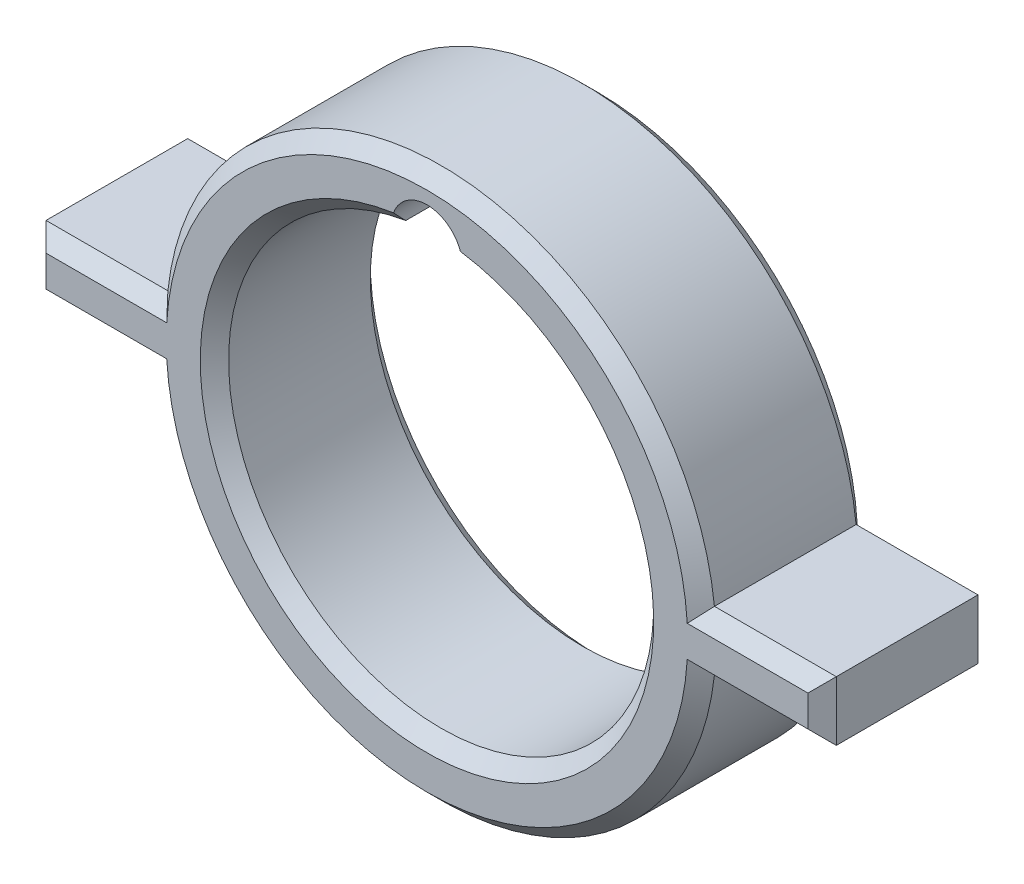
ISO-10303-21;
HEADER;
FILE_DESCRIPTION(('STEP AP214'),'2;1');
FILE_NAME('part.step','',(''),(''),'','','');
FILE_SCHEMA(('AUTOMOTIVE_DESIGN { 1 0 10303 214 1 1 1 1 }'));
ENDSEC;
DATA;
#1=APPLICATION_CONTEXT('core data for automotive mechanical design processes');
#2=APPLICATION_PROTOCOL_DEFINITION('international standard','automotive_design',2000,#1);
#3=PRODUCT_CONTEXT('',#1,'mechanical');
#4=PRODUCT('Part','Part','',(#3));
#5=PRODUCT_RELATED_PRODUCT_CATEGORY('part','',(#4));
#6=PRODUCT_DEFINITION_FORMATION('','',#4);
#7=PRODUCT_DEFINITION_CONTEXT('part definition',#1,'design');
#8=PRODUCT_DEFINITION('design','',#6,#7);
#9=PRODUCT_DEFINITION_SHAPE('','',#8);
#10=(LENGTH_UNIT() NAMED_UNIT(*) SI_UNIT(.MILLI.,.METRE.));
#11=(NAMED_UNIT(*) PLANE_ANGLE_UNIT() SI_UNIT($,.RADIAN.));
#12=(NAMED_UNIT(*) SI_UNIT($,.STERADIAN.) SOLID_ANGLE_UNIT());
#13=UNCERTAINTY_MEASURE_WITH_UNIT(LENGTH_MEASURE(1.E-05),#10,'distance_accuracy_value','');
#14=(GEOMETRIC_REPRESENTATION_CONTEXT(3) GLOBAL_UNCERTAINTY_ASSIGNED_CONTEXT((#13)) GLOBAL_UNIT_ASSIGNED_CONTEXT((#10,
#11,#12)) REPRESENTATION_CONTEXT('',''));
#15=CARTESIAN_POINT('',(0.,0.,0.));
#16=DIRECTION('',(0.,0.,1.));
#17=DIRECTION('',(1.,0.,0.));
#18=AXIS2_PLACEMENT_3D('',#15,#16,#17);
#19=CARTESIAN_POINT('',(0.,0.,6.));
#20=DIRECTION('',(0.,0.,1.));
#21=DIRECTION('',(1.,0.,0.));
#22=AXIS2_PLACEMENT_3D('',#19,#20,#21);
#23=PLANE('',#22);
#24=CARTESIAN_POINT('',(0.,7.5,6.));
#25=DIRECTION('',(0.,0.,1.));
#26=DIRECTION('',(1.,0.,0.));
#27=AXIS2_PLACEMENT_3D('',#24,#25,#26);
#28=CIRCLE('',#27,1.25);
#29=CARTESIAN_POINT('',(1.17997616501351,7.91250000000001,6.));
#30=VERTEX_POINT('',#29);
#31=CARTESIAN_POINT('',(-1.17997616501351,7.91250000000001,6.));
#32=VERTEX_POINT('',#31);
#33=EDGE_CURVE('E324',#30,#32,#28,.T.);
#34=ORIENTED_EDGE('',*,*,#33,.F.);
#35=CARTESIAN_POINT('',(0.,0.,6.));
#36=DIRECTION('',(0.,0.,1.));
#37=DIRECTION('',(1.,0.,0.));
#38=AXIS2_PLACEMENT_3D('',#35,#36,#37);
#39=CIRCLE('',#38,8.00000000000001);
#40=EDGE_CURVE('E386',#30,#32,#39,.F.);
#41=ORIENTED_EDGE('',*,*,#40,.T.);
#42=EDGE_LOOP('',(#34,#41));
#43=FACE_BOUND('',#42,.T.);
#44=DIRECTION('',(-1.,0.,0.));
#45=VECTOR('',#44,1.);
#46=CARTESIAN_POINT('',(9.6430026444049,0.550000000000006,6.));
#47=LINE('',#46,#45);
#48=CARTESIAN_POINT('',(13.4430026444049,0.550000000000006,6.));
#49=VERTEX_POINT('',#48);
#50=CARTESIAN_POINT('',(9.18354506712958,0.550000000000006,6.));
#51=VERTEX_POINT('',#50);
#52=EDGE_CURVE('E381',#49,#51,#47,.T.);
#53=ORIENTED_EDGE('',*,*,#52,.T.);
#54=CARTESIAN_POINT('',(0.,0.,6.));
#55=DIRECTION('',(0.,0.,1.));
#56=DIRECTION('',(1.,0.,0.));
#57=AXIS2_PLACEMENT_3D('',#54,#55,#56);
#58=CIRCLE('',#57,9.2);
#59=CARTESIAN_POINT('',(-9.18354506712958,0.550000000000004,6.));
#60=VERTEX_POINT('',#59);
#61=EDGE_CURVE('E383',#51,#60,#58,.T.);
#62=ORIENTED_EDGE('',*,*,#61,.T.);
#63=DIRECTION('',(-1.,0.,0.));
#64=VECTOR('',#63,1.);
#65=CARTESIAN_POINT('',(-13.9430026444049,0.550000000000003,6.));
#66=LINE('',#65,#64);
#67=CARTESIAN_POINT('',(-13.4430026444049,0.550000000000003,6.));
#68=VERTEX_POINT('',#67);
#69=EDGE_CURVE('E369',#60,#68,#66,.T.);
#70=ORIENTED_EDGE('',*,*,#69,.T.);
#71=DIRECTION('',(0.,-1.,0.));
#72=VECTOR('',#71,1.);
#73=CARTESIAN_POINT('',(-13.4430026444049,-1.05,6.));
#74=LINE('',#73,#72);
#75=CARTESIAN_POINT('',(-13.4430026444049,-0.550000000000003,6.));
#76=VERTEX_POINT('',#75);
#77=EDGE_CURVE('E371',#68,#76,#74,.T.);
#78=ORIENTED_EDGE('',*,*,#77,.T.);
#79=DIRECTION('',(1.,0.,0.));
#80=VECTOR('',#79,1.);
#81=CARTESIAN_POINT('',(-9.6430026444049,-0.550000000000004,6.));
#82=LINE('',#81,#80);
#83=CARTESIAN_POINT('',(-9.18354506712958,-0.550000000000004,6.));
#84=VERTEX_POINT('',#83);
#85=EDGE_CURVE('E373',#76,#84,#82,.T.);
#86=ORIENTED_EDGE('',*,*,#85,.T.);
#87=CARTESIAN_POINT('',(0.,0.,6.));
#88=DIRECTION('',(0.,0.,1.));
#89=DIRECTION('',(1.,0.,0.));
#90=AXIS2_PLACEMENT_3D('',#87,#88,#89);
#91=CIRCLE('',#90,9.2);
#92=CARTESIAN_POINT('',(9.18354506712958,-0.550000000000007,6.));
#93=VERTEX_POINT('',#92);
#94=EDGE_CURVE('E375',#84,#93,#91,.T.);
#95=ORIENTED_EDGE('',*,*,#94,.T.);
#96=DIRECTION('',(1.,0.,0.));
#97=VECTOR('',#96,1.);
#98=CARTESIAN_POINT('',(13.9430026444049,-0.55,6.));
#99=LINE('',#98,#97);
#100=CARTESIAN_POINT('',(13.4430026444049,-0.55,6.));
#101=VERTEX_POINT('',#100);
#102=EDGE_CURVE('E377',#93,#101,#99,.T.);
#103=ORIENTED_EDGE('',*,*,#102,.T.);
#104=DIRECTION('',(0.,1.,0.));
#105=VECTOR('',#104,1.);
#106=CARTESIAN_POINT('',(13.4430026444049,1.05,6.));
#107=LINE('',#106,#105);
#108=EDGE_CURVE('E379',#101,#49,#107,.T.);
#109=ORIENTED_EDGE('',*,*,#108,.T.);
#110=EDGE_LOOP('',(#53,#62,#70,#78,#86,#95,#103,#109));
#111=FACE_BOUND('',#110,.T.);
#112=ADVANCED_FACE('F41',(#43,#111),#23,.T.);
#113=CARTESIAN_POINT('',(0.,0.,0.));
#114=DIRECTION('',(0.,0.,1.));
#115=DIRECTION('',(1.,0.,0.));
#116=AXIS2_PLACEMENT_3D('',#113,#114,#115);
#117=PLANE('',#116);
#118=CARTESIAN_POINT('',(0.,0.,0.));
#119=DIRECTION('',(0.,0.,1.));
#120=DIRECTION('',(1.,0.,0.));
#121=AXIS2_PLACEMENT_3D('',#118,#119,#120);
#122=CIRCLE('',#121,7.99999999999999);
#123=CARTESIAN_POINT('',(-1.17997616501352,7.91249999999999,0.));
#124=VERTEX_POINT('',#123);
#125=CARTESIAN_POINT('',(1.17997616501352,7.91249999999999,0.));
#126=VERTEX_POINT('',#125);
#127=EDGE_CURVE('E193',#124,#126,#122,.T.);
#128=ORIENTED_EDGE('',*,*,#127,.T.);
#129=CARTESIAN_POINT('',(0.,7.5,0.));
#130=DIRECTION('',(0.,0.,-1.));
#131=DIRECTION('',(-1.,0.,0.));
#132=AXIS2_PLACEMENT_3D('',#129,#130,#131);
#133=CIRCLE('',#132,1.25);
#134=EDGE_CURVE('E62',#124,#126,#133,.T.);
#135=ORIENTED_EDGE('',*,*,#134,.F.);
#136=EDGE_LOOP('',(#128,#135));
#137=FACE_BOUND('',#136,.T.);
#138=DIRECTION('',(-1.,0.,0.));
#139=VECTOR('',#138,1.);
#140=CARTESIAN_POINT('',(0.,-0.550000000000005,0.));
#141=LINE('',#140,#139);
#142=CARTESIAN_POINT('',(-9.18354506712958,-0.550000000000004,0.));
#143=VERTEX_POINT('',#142);
#144=CARTESIAN_POINT('',(-13.4430026444049,-0.550000000000003,0.));
#145=VERTEX_POINT('',#144);
#146=EDGE_CURVE('E70',#143,#145,#141,.T.);
#147=ORIENTED_EDGE('',*,*,#146,.T.);
#148=DIRECTION('',(0.,1.,0.));
#149=VECTOR('',#148,1.);
#150=CARTESIAN_POINT('',(-13.4430026444049,0.,0.));
#151=LINE('',#150,#149);
#152=CARTESIAN_POINT('',(-13.4430026444049,0.550000000000003,0.));
#153=VERTEX_POINT('',#152);
#154=EDGE_CURVE('E197',#145,#153,#151,.T.);
#155=ORIENTED_EDGE('',*,*,#154,.T.);
#156=DIRECTION('',(1.,0.,0.));
#157=VECTOR('',#156,1.);
#158=CARTESIAN_POINT('',(0.,0.550000000000005,0.));
#159=LINE('',#158,#157);
#160=CARTESIAN_POINT('',(-9.18354506712958,0.550000000000004,0.));
#161=VERTEX_POINT('',#160);
#162=EDGE_CURVE('E423',#153,#161,#159,.T.);
#163=ORIENTED_EDGE('',*,*,#162,.T.);
#164=CARTESIAN_POINT('',(0.,0.,0.));
#165=DIRECTION('',(0.,0.,1.));
#166=DIRECTION('',(1.,0.,0.));
#167=AXIS2_PLACEMENT_3D('',#164,#165,#166);
#168=CIRCLE('',#167,9.2);
#169=CARTESIAN_POINT('',(9.18354506712958,0.550000000000006,0.));
#170=VERTEX_POINT('',#169);
#171=EDGE_CURVE('E425',#161,#170,#168,.F.);
#172=ORIENTED_EDGE('',*,*,#171,.T.);
#173=DIRECTION('',(1.,0.,0.));
#174=VECTOR('',#173,1.);
#175=CARTESIAN_POINT('',(0.,0.550000000000005,0.));
#176=LINE('',#175,#174);
#177=CARTESIAN_POINT('',(13.4430026444049,0.550000000000006,0.));
#178=VERTEX_POINT('',#177);
#179=EDGE_CURVE('E427',#170,#178,#176,.T.);
#180=ORIENTED_EDGE('',*,*,#179,.T.);
#181=DIRECTION('',(0.,-1.,0.));
#182=VECTOR('',#181,1.);
#183=CARTESIAN_POINT('',(13.4430026444049,0.,0.));
#184=LINE('',#183,#182);
#185=CARTESIAN_POINT('',(13.4430026444049,-0.55,0.));
#186=VERTEX_POINT('',#185);
#187=EDGE_CURVE('E429',#178,#186,#184,.T.);
#188=ORIENTED_EDGE('',*,*,#187,.T.);
#189=DIRECTION('',(-1.,0.,0.));
#190=VECTOR('',#189,1.);
#191=CARTESIAN_POINT('',(0.,-0.55000000000002,0.));
#192=LINE('',#191,#190);
#193=CARTESIAN_POINT('',(9.18354506712958,-0.550000000000007,0.));
#194=VERTEX_POINT('',#193);
#195=EDGE_CURVE('E431',#186,#194,#192,.T.);
#196=ORIENTED_EDGE('',*,*,#195,.T.);
#197=CARTESIAN_POINT('',(0.,0.,0.));
#198=DIRECTION('',(0.,0.,1.));
#199=DIRECTION('',(1.,0.,0.));
#200=AXIS2_PLACEMENT_3D('',#197,#198,#199);
#201=CIRCLE('',#200,9.2);
#202=EDGE_CURVE('E433',#194,#143,#201,.F.);
#203=ORIENTED_EDGE('',*,*,#202,.T.);
#204=EDGE_LOOP('',(#147,#155,#163,#172,#180,#188,#196,#203));
#205=FACE_BOUND('',#204,.T.);
#206=ADVANCED_FACE('F192',(#137,#205),#117,.F.);
#207=CARTESIAN_POINT('',(-9.6430026444049,1.05,6.));
#208=DIRECTION('',(0.,-1.,0.));
#209=DIRECTION('',(1.,0.,0.));
#210=AXIS2_PLACEMENT_3D('',#207,#208,#209);
#211=PLANE('',#210);
#212=DIRECTION('',(0.,0.,-1.));
#213=VECTOR('',#212,1.);
#214=CARTESIAN_POINT('',(-13.9430026444049,1.05,6.));
#215=LINE('',#214,#213);
#216=CARTESIAN_POINT('',(-13.9430026444049,1.05,5.5));
#217=VERTEX_POINT('',#216);
#218=CARTESIAN_POINT('',(-13.9430026444049,1.05,0.499999999999997));
#219=VERTEX_POINT('',#218);
#220=EDGE_CURVE('E361',#217,#219,#215,.T.);
#221=ORIENTED_EDGE('',*,*,#220,.F.);
#222=DIRECTION('',(1.,0.,0.));
#223=VECTOR('',#222,1.);
#224=CARTESIAN_POINT('',(-9.6430026444049,1.05,5.5));
#225=LINE('',#224,#223);
#226=CARTESIAN_POINT('',(-9.6430026444049,1.05,5.5));
#227=VERTEX_POINT('',#226);
#228=EDGE_CURVE('E421',#217,#227,#225,.T.);
#229=ORIENTED_EDGE('',*,*,#228,.T.);
#230=DIRECTION('',(0.,0.,-1.));
#231=VECTOR('',#230,1.);
#232=CARTESIAN_POINT('',(-9.6430026444049,1.05,6.));
#233=LINE('',#232,#231);
#234=CARTESIAN_POINT('',(-9.6430026444049,1.05,0.499999999999997));
#235=VERTEX_POINT('',#234);
#236=EDGE_CURVE('E281',#227,#235,#233,.T.);
#237=ORIENTED_EDGE('',*,*,#236,.T.);
#238=DIRECTION('',(-1.,0.,0.));
#239=VECTOR('',#238,1.);
#240=CARTESIAN_POINT('',(-9.6430026444049,1.05,0.499999999999997));
#241=LINE('',#240,#239);
#242=EDGE_CURVE('E419',#235,#219,#241,.T.);
#243=ORIENTED_EDGE('',*,*,#242,.T.);
#244=EDGE_LOOP('',(#221,#229,#237,#243));
#245=FACE_BOUND('',#244,.T.);
#246=ADVANCED_FACE('F331',(#245),#211,.F.);
#247=CARTESIAN_POINT('',(-13.9430026444049,1.05,6.));
#248=DIRECTION('',(1.,0.,0.));
#249=DIRECTION('',(0.,0.,-1.));
#250=AXIS2_PLACEMENT_3D('',#247,#248,#249);
#251=PLANE('',#250);
#252=DIRECTION('',(0.,0.,-1.));
#253=VECTOR('',#252,1.);
#254=CARTESIAN_POINT('',(-13.9430026444049,-1.05,6.));
#255=LINE('',#254,#253);
#256=CARTESIAN_POINT('',(-13.9430026444049,-1.05,5.5));
#257=VERTEX_POINT('',#256);
#258=CARTESIAN_POINT('',(-13.9430026444049,-1.05,0.499999999999997));
#259=VERTEX_POINT('',#258);
#260=EDGE_CURVE('E358',#257,#259,#255,.T.);
#261=ORIENTED_EDGE('',*,*,#260,.F.);
#262=DIRECTION('',(0.,1.,0.));
#263=VECTOR('',#262,1.);
#264=CARTESIAN_POINT('',(-13.9430026444049,1.05,5.5));
#265=LINE('',#264,#263);
#266=EDGE_CURVE('E417',#257,#217,#265,.T.);
#267=ORIENTED_EDGE('',*,*,#266,.T.);
#268=ORIENTED_EDGE('',*,*,#220,.T.);
#269=DIRECTION('',(0.,-1.,0.));
#270=VECTOR('',#269,1.);
#271=CARTESIAN_POINT('',(-13.9430026444049,1.05,0.499999999999997));
#272=LINE('',#271,#270);
#273=EDGE_CURVE('E414',#219,#259,#272,.T.);
#274=ORIENTED_EDGE('',*,*,#273,.T.);
#275=EDGE_LOOP('',(#261,#267,#268,#274));
#276=FACE_BOUND('',#275,.T.);
#277=ADVANCED_FACE('F545',(#276),#251,.F.);
#278=CARTESIAN_POINT('',(-13.9430026444049,-1.05,6.));
#279=DIRECTION('',(0.,1.,0.));
#280=DIRECTION('',(-1.,0.,0.));
#281=AXIS2_PLACEMENT_3D('',#278,#279,#280);
#282=PLANE('',#281);
#283=DIRECTION('',(0.,0.,-1.));
#284=VECTOR('',#283,1.);
#285=CARTESIAN_POINT('',(-9.6430026444049,-1.05,6.));
#286=LINE('',#285,#284);
#287=CARTESIAN_POINT('',(-9.6430026444049,-1.05,5.5));
#288=VERTEX_POINT('',#287);
#289=CARTESIAN_POINT('',(-9.6430026444049,-1.05,0.499999999999997));
#290=VERTEX_POINT('',#289);
#291=EDGE_CURVE('E355',#288,#290,#286,.T.);
#292=ORIENTED_EDGE('',*,*,#291,.F.);
#293=DIRECTION('',(-1.,0.,0.));
#294=VECTOR('',#293,1.);
#295=CARTESIAN_POINT('',(-13.9430026444049,-1.05,5.5));
#296=LINE('',#295,#294);
#297=EDGE_CURVE('E412',#288,#257,#296,.T.);
#298=ORIENTED_EDGE('',*,*,#297,.T.);
#299=ORIENTED_EDGE('',*,*,#260,.T.);
#300=DIRECTION('',(1.,0.,0.));
#301=VECTOR('',#300,1.);
#302=CARTESIAN_POINT('',(-13.9430026444049,-1.05,0.499999999999997));
#303=LINE('',#302,#301);
#304=EDGE_CURVE('E410',#259,#290,#303,.T.);
#305=ORIENTED_EDGE('',*,*,#304,.T.);
#306=EDGE_LOOP('',(#292,#298,#299,#305));
#307=FACE_BOUND('',#306,.T.);
#308=ADVANCED_FACE('F542',(#307),#282,.F.);
#309=CARTESIAN_POINT('',(0.,0.,6.));
#310=DIRECTION('',(0.,0.,-1.));
#311=DIRECTION('',(-1.,0.,0.));
#312=AXIS2_PLACEMENT_3D('',#309,#310,#311);
#313=CYLINDRICAL_SURFACE('',#312,9.7);
#314=DIRECTION('',(0.,0.,-1.));
#315=VECTOR('',#314,1.);
#316=CARTESIAN_POINT('',(9.6430026444049,-1.05,6.));
#317=LINE('',#316,#315);
#318=CARTESIAN_POINT('',(9.6430026444049,-1.05,5.5));
#319=VERTEX_POINT('',#318);
#320=CARTESIAN_POINT('',(9.6430026444049,-1.05,0.499999999999997));
#321=VERTEX_POINT('',#320);
#322=EDGE_CURVE('E352',#319,#321,#317,.T.);
#323=ORIENTED_EDGE('',*,*,#322,.F.);
#324=CARTESIAN_POINT('',(0.,0.,5.5));
#325=DIRECTION('',(0.,0.,1.));
#326=DIRECTION('',(1.,0.,0.));
#327=AXIS2_PLACEMENT_3D('',#324,#325,#326);
#328=CIRCLE('',#327,9.7);
#329=EDGE_CURVE('E408',#319,#288,#328,.F.);
#330=ORIENTED_EDGE('',*,*,#329,.T.);
#331=ORIENTED_EDGE('',*,*,#291,.T.);
#332=CARTESIAN_POINT('',(0.,0.,0.499999999999997));
#333=DIRECTION('',(0.,0.,1.));
#334=DIRECTION('',(1.,0.,0.));
#335=AXIS2_PLACEMENT_3D('',#332,#333,#334);
#336=CIRCLE('',#335,9.7);
#337=EDGE_CURVE('E406',#290,#321,#336,.T.);
#338=ORIENTED_EDGE('',*,*,#337,.T.);
#339=EDGE_LOOP('',(#323,#330,#331,#338));
#340=FACE_BOUND('',#339,.T.);
#341=ADVANCED_FACE('F538',(#340),#313,.T.);
#342=CARTESIAN_POINT('',(9.6430026444049,-1.05,6.));
#343=DIRECTION('',(0.,1.,0.));
#344=DIRECTION('',(-1.,0.,0.));
#345=AXIS2_PLACEMENT_3D('',#342,#343,#344);
#346=PLANE('',#345);
#347=DIRECTION('',(0.,0.,-1.));
#348=VECTOR('',#347,1.);
#349=CARTESIAN_POINT('',(13.9430026444049,-1.05,6.));
#350=LINE('',#349,#348);
#351=CARTESIAN_POINT('',(13.9430026444049,-1.05,5.5));
#352=VERTEX_POINT('',#351);
#353=CARTESIAN_POINT('',(13.9430026444049,-1.05,0.499999999999997));
#354=VERTEX_POINT('',#353);
#355=EDGE_CURVE('E349',#352,#354,#350,.T.);
#356=ORIENTED_EDGE('',*,*,#355,.F.);
#357=DIRECTION('',(-1.,0.,0.));
#358=VECTOR('',#357,1.);
#359=CARTESIAN_POINT('',(9.6430026444049,-1.05,5.5));
#360=LINE('',#359,#358);
#361=EDGE_CURVE('E404',#352,#319,#360,.T.);
#362=ORIENTED_EDGE('',*,*,#361,.T.);
#363=ORIENTED_EDGE('',*,*,#322,.T.);
#364=DIRECTION('',(1.,0.,0.));
#365=VECTOR('',#364,1.);
#366=CARTESIAN_POINT('',(9.6430026444049,-1.05,0.499999999999997));
#367=LINE('',#366,#365);
#368=EDGE_CURVE('E402',#321,#354,#367,.T.);
#369=ORIENTED_EDGE('',*,*,#368,.T.);
#370=EDGE_LOOP('',(#356,#362,#363,#369));
#371=FACE_BOUND('',#370,.T.);
#372=ADVANCED_FACE('F534',(#371),#346,.F.);
#373=CARTESIAN_POINT('',(13.9430026444049,-1.05,6.));
#374=DIRECTION('',(-1.,0.,0.));
#375=DIRECTION('',(0.,0.,1.));
#376=AXIS2_PLACEMENT_3D('',#373,#374,#375);
#377=PLANE('',#376);
#378=DIRECTION('',(0.,0.,-1.));
#379=VECTOR('',#378,1.);
#380=CARTESIAN_POINT('',(13.9430026444049,1.05,6.));
#381=LINE('',#380,#379);
#382=CARTESIAN_POINT('',(13.9430026444049,1.05,5.5));
#383=VERTEX_POINT('',#382);
#384=CARTESIAN_POINT('',(13.9430026444049,1.05,0.499999999999997));
#385=VERTEX_POINT('',#384);
#386=EDGE_CURVE('E346',#383,#385,#381,.T.);
#387=ORIENTED_EDGE('',*,*,#386,.F.);
#388=DIRECTION('',(0.,-1.,0.));
#389=VECTOR('',#388,1.);
#390=CARTESIAN_POINT('',(13.9430026444049,-1.05,5.5));
#391=LINE('',#390,#389);
#392=EDGE_CURVE('E400',#383,#352,#391,.T.);
#393=ORIENTED_EDGE('',*,*,#392,.T.);
#394=ORIENTED_EDGE('',*,*,#355,.T.);
#395=DIRECTION('',(0.,1.,0.));
#396=VECTOR('',#395,1.);
#397=CARTESIAN_POINT('',(13.9430026444049,-1.05,0.499999999999997));
#398=LINE('',#397,#396);
#399=EDGE_CURVE('E398',#354,#385,#398,.T.);
#400=ORIENTED_EDGE('',*,*,#399,.T.);
#401=EDGE_LOOP('',(#387,#393,#394,#400));
#402=FACE_BOUND('',#401,.T.);
#403=ADVANCED_FACE('F530',(#402),#377,.F.);
#404=CARTESIAN_POINT('',(13.9430026444049,1.05,6.));
#405=DIRECTION('',(0.,-1.,0.));
#406=DIRECTION('',(1.,0.,0.));
#407=AXIS2_PLACEMENT_3D('',#404,#405,#406);
#408=PLANE('',#407);
#409=DIRECTION('',(0.,0.,-1.));
#410=VECTOR('',#409,1.);
#411=CARTESIAN_POINT('',(9.6430026444049,1.05,6.));
#412=LINE('',#411,#410);
#413=CARTESIAN_POINT('',(9.6430026444049,1.05,5.5));
#414=VERTEX_POINT('',#413);
#415=CARTESIAN_POINT('',(9.6430026444049,1.05,0.499999999999997));
#416=VERTEX_POINT('',#415);
#417=EDGE_CURVE('E343',#414,#416,#412,.T.);
#418=ORIENTED_EDGE('',*,*,#417,.F.);
#419=DIRECTION('',(1.,0.,0.));
#420=VECTOR('',#419,1.);
#421=CARTESIAN_POINT('',(13.9430026444049,1.05,5.5));
#422=LINE('',#421,#420);
#423=EDGE_CURVE('E396',#414,#383,#422,.T.);
#424=ORIENTED_EDGE('',*,*,#423,.T.);
#425=ORIENTED_EDGE('',*,*,#386,.T.);
#426=DIRECTION('',(-1.,0.,0.));
#427=VECTOR('',#426,1.);
#428=CARTESIAN_POINT('',(13.9430026444049,1.05,0.499999999999997));
#429=LINE('',#428,#427);
#430=EDGE_CURVE('E394',#385,#416,#429,.T.);
#431=ORIENTED_EDGE('',*,*,#430,.T.);
#432=EDGE_LOOP('',(#418,#424,#425,#431));
#433=FACE_BOUND('',#432,.T.);
#434=ADVANCED_FACE('F526',(#433),#408,.F.);
#435=CARTESIAN_POINT('',(0.,0.,6.));
#436=DIRECTION('',(0.,0.,-1.));
#437=DIRECTION('',(-1.,0.,0.));
#438=AXIS2_PLACEMENT_3D('',#435,#436,#437);
#439=CYLINDRICAL_SURFACE('',#438,9.7);
#440=ORIENTED_EDGE('',*,*,#236,.F.);
#441=CARTESIAN_POINT('',(0.,0.,5.5));
#442=DIRECTION('',(0.,0.,1.));
#443=DIRECTION('',(1.,0.,0.));
#444=AXIS2_PLACEMENT_3D('',#441,#442,#443);
#445=CIRCLE('',#444,9.7);
#446=EDGE_CURVE('E391',#227,#414,#445,.F.);
#447=ORIENTED_EDGE('',*,*,#446,.T.);
#448=ORIENTED_EDGE('',*,*,#417,.T.);
#449=CARTESIAN_POINT('',(0.,0.,0.499999999999997));
#450=DIRECTION('',(0.,0.,1.));
#451=DIRECTION('',(1.,0.,0.));
#452=AXIS2_PLACEMENT_3D('',#449,#450,#451);
#453=CIRCLE('',#452,9.7);
#454=EDGE_CURVE('E389',#416,#235,#453,.T.);
#455=ORIENTED_EDGE('',*,*,#454,.T.);
#456=EDGE_LOOP('',(#440,#447,#448,#455));
#457=FACE_BOUND('',#456,.T.);
#458=ADVANCED_FACE('F523',(#457),#439,.T.);
#459=CARTESIAN_POINT('',(0.,0.,6.));
#460=DIRECTION('',(0.,0.,-1.));
#461=DIRECTION('',(-1.,0.,0.));
#462=AXIS2_PLACEMENT_3D('',#459,#460,#461);
#463=CYLINDRICAL_SURFACE('',#462,7.5);
#464=DIRECTION('',(0.,0.,-1.));
#465=VECTOR('',#464,1.);
#466=CARTESIAN_POINT('',(1.24565216073973,7.39583333333333,5.));
#467=LINE('',#466,#465);
#468=CARTESIAN_POINT('',(1.24565216073973,7.39583333333333,0.499999999999991));
#469=VERTEX_POINT('',#468);
#470=CARTESIAN_POINT('',(1.24565216073973,7.39583333333333,5.49999999999999));
#471=VERTEX_POINT('',#470);
#472=EDGE_CURVE('E194',#469,#471,#467,.F.);
#473=ORIENTED_EDGE('',*,*,#472,.F.);
#474=CARTESIAN_POINT('',(0.,0.,0.499999999999992));
#475=DIRECTION('',(0.,0.,1.));
#476=DIRECTION('',(1.,0.,0.));
#477=AXIS2_PLACEMENT_3D('',#474,#475,#476);
#478=CIRCLE('',#477,7.5);
#479=CARTESIAN_POINT('',(-1.24565216073973,7.39583333333333,0.499999999999992));
#480=VERTEX_POINT('',#479);
#481=EDGE_CURVE('E364',#469,#480,#478,.F.);
#482=ORIENTED_EDGE('',*,*,#481,.T.);
#483=DIRECTION('',(0.,0.,-1.));
#484=VECTOR('',#483,1.);
#485=CARTESIAN_POINT('',(-1.24565216073973,7.39583333333333,5.));
#486=LINE('',#485,#484);
#487=CARTESIAN_POINT('',(-1.24565216073973,7.39583333333333,5.49999999999999));
#488=VERTEX_POINT('',#487);
#489=EDGE_CURVE('E185',#488,#480,#486,.T.);
#490=ORIENTED_EDGE('',*,*,#489,.F.);
#491=CARTESIAN_POINT('',(0.,0.,5.49999999999999));
#492=DIRECTION('',(0.,0.,1.));
#493=DIRECTION('',(1.,0.,0.));
#494=AXIS2_PLACEMENT_3D('',#491,#492,#493);
#495=CIRCLE('',#494,7.5);
#496=EDGE_CURVE('E366',#488,#471,#495,.T.);
#497=ORIENTED_EDGE('',*,*,#496,.T.);
#498=EDGE_LOOP('',(#473,#482,#490,#497));
#499=FACE_BOUND('',#498,.T.);
#500=ADVANCED_FACE('F310',(#499),#463,.F.);
#501=CARTESIAN_POINT('',(0.,0.,5.49999999999999));
#502=DIRECTION('',(0.,0.,1.));
#503=DIRECTION('',(1.,0.,0.));
#504=AXIS2_PLACEMENT_3D('',#501,#502,#503);
#505=CONICAL_SURFACE('',#504,7.5,0.785398163397449);
#506=CARTESIAN_POINT('',(-1.17990156466027,7.91271333600001,6.0002));
#507=CARTESIAN_POINT('',(-1.19489036854436,7.86983595960635,5.96000609546591));
#508=CARTESIAN_POINT('',(-1.20737842633653,7.82666422847515,5.91922811670423));
#509=CARTESIAN_POINT('',(-1.2274808863644,7.7403103211031,5.83701625418183));
#510=CARTESIAN_POINT('',(-1.23512378706325,7.6971297290057,5.79558770277453));
#511=CARTESIAN_POINT('',(-1.24583651627634,7.61082477321702,5.71210829207661));
#512=CARTESIAN_POINT('',(-1.24890689632759,7.56770040337126,5.67005750845764));
#513=CARTESIAN_POINT('',(-1.25060893215097,7.48149955422386,5.58530216936346));
#514=CARTESIAN_POINT('',(-1.24921397342433,7.43842489856009,5.5425952093987));
#515=CARTESIAN_POINT('',(-1.24563541995462,7.39563333600002,5.49980000000001));
#516=B_SPLINE_CURVE_WITH_KNOTS('',3,(#506,#507,#508,#509,#510,#511,#512,#513,#514,#515),
.UNSPECIFIED.,.F.,.F.,(4,2,2,2,4),(0.,0.181868410105899,0.362656923178911,0.543423627792339,
0.725269747283323),.UNSPECIFIED.);
#517=EDGE_CURVE('E334',#32,#488,#516,.T.);
#518=ORIENTED_EDGE('',*,*,#517,.F.);
#519=ORIENTED_EDGE('',*,*,#40,.F.);
#520=CARTESIAN_POINT('',(1.24563541995462,7.39563333600002,5.49980000000001));
#521=CARTESIAN_POINT('',(1.24921397342433,7.43842489856009,5.5425952093987));
#522=CARTESIAN_POINT('',(1.25060893215097,7.48149955422386,5.58530216936346));
#523=CARTESIAN_POINT('',(1.24890689632759,7.56770040337126,5.67005750845764));
#524=CARTESIAN_POINT('',(1.24583651627634,7.61082477321702,5.71210829207661));
#525=CARTESIAN_POINT('',(1.23512378706325,7.6971297290057,5.79558770277453));
#526=CARTESIAN_POINT('',(1.2274808863644,7.74031032110309,5.83701625418183));
#527=CARTESIAN_POINT('',(1.20737842633653,7.82666422847514,5.91922811670423));
#528=CARTESIAN_POINT('',(1.19489036854436,7.86983595960635,5.96000609546591));
#529=CARTESIAN_POINT('',(1.17990156466027,7.91271333600001,6.0002));
#530=B_SPLINE_CURVE_WITH_KNOTS('',3,(#520,#521,#522,#523,#524,#525,#526,#527,#528,#529),
.UNSPECIFIED.,.F.,.F.,(4,2,2,2,4),(0.,0.181846119490983,0.362612824104411,0.543401337177421,
0.725269747283323),.UNSPECIFIED.);
#531=EDGE_CURVE('E317',#471,#30,#530,.T.);
#532=ORIENTED_EDGE('',*,*,#531,.F.);
#533=ORIENTED_EDGE('',*,*,#496,.F.);
#534=EDGE_LOOP('',(#518,#519,#532,#533));
#535=FACE_BOUND('',#534,.T.);
#536=ADVANCED_FACE('F261',(#535),#505,.F.);
#537=CARTESIAN_POINT('',(0.,0.,6.));
#538=DIRECTION('',(0.,0.,-1.));
#539=DIRECTION('',(-1.,0.,0.));
#540=AXIS2_PLACEMENT_3D('',#537,#538,#539);
#541=CONICAL_SURFACE('',#540,9.2,0.785398163397448);
#542=CARTESIAN_POINT('',(-9.6430026444049,-1.05,5.5));
#543=CARTESIAN_POINT('',(-9.56774038324807,-0.96606303608775,5.58393696391225));
#544=CARTESIAN_POINT('',(-9.49182115325673,-0.882427921481516,5.66757207851849));
#545=CARTESIAN_POINT('',(-9.33866862965934,-0.715761253821939,5.83423874617807));
#546=CARTESIAN_POINT('',(-9.26143533389224,-0.632729701761507,5.9172702982385));
#547=CARTESIAN_POINT('',(-9.18354506712958,-0.550000000000002,6.));
#548=B_SPLINE_CURVE_WITH_KNOTS('',3,(#542,#543,#544,#545,#546,#547),.UNSPECIFIED.,.F.,.F.,(4,2,
4),(0.,0.42164030696301,0.843281307402478),.UNSPECIFIED.);
#549=EDGE_CURVE('E267',#288,#84,#548,.T.);
#550=ORIENTED_EDGE('',*,*,#549,.F.);
#551=ORIENTED_EDGE('',*,*,#329,.F.);
#552=CARTESIAN_POINT('',(9.6430026444049,-1.05,5.5));
#553=CARTESIAN_POINT('',(9.56774038324807,-0.966063036087752,5.58393696391225));
#554=CARTESIAN_POINT('',(9.49182115325673,-0.882427921481517,5.66757207851849));
#555=CARTESIAN_POINT('',(9.33866862965934,-0.715761253821941,5.83423874617807));
#556=CARTESIAN_POINT('',(9.26143533389223,-0.63272970176151,5.9172702982385));
#557=CARTESIAN_POINT('',(9.18354506712958,-0.550000000000005,6.));
#558=B_SPLINE_CURVE_WITH_KNOTS('',3,(#552,#553,#554,#555,#556,#557),.UNSPECIFIED.,.F.,.F.,(4,2,
4),(0.,0.421640306963012,0.843281307402478),.UNSPECIFIED.);
#559=EDGE_CURVE('E274',#93,#319,#558,.F.);
#560=ORIENTED_EDGE('',*,*,#559,.F.);
#561=ORIENTED_EDGE('',*,*,#94,.F.);
#562=EDGE_LOOP('',(#550,#551,#560,#561));
#563=FACE_BOUND('',#562,.T.);
#564=ADVANCED_FACE('F253',(#563),#541,.T.);
#565=CARTESIAN_POINT('',(0.,-0.55000000000002,6.));
#566=DIRECTION('',(0.,-0.707106781186547,0.707106781186547));
#567=DIRECTION('',(-1.,0.,0.));
#568=AXIS2_PLACEMENT_3D('',#565,#566,#567);
#569=PLANE('',#568);
#570=ORIENTED_EDGE('',*,*,#559,.T.);
#571=ORIENTED_EDGE('',*,*,#361,.F.);
#572=DIRECTION('',(-0.577350269189626,0.577350269189625,0.577350269189626));
#573=VECTOR('',#572,1.);
#574=CARTESIAN_POINT('',(8.96200176293661,3.93100088146829,10.4810008814683));
#575=LINE('',#574,#573);
#576=EDGE_CURVE('E564',#101,#352,#575,.F.);
#577=ORIENTED_EDGE('',*,*,#576,.F.);
#578=ORIENTED_EDGE('',*,*,#102,.F.);
#579=EDGE_LOOP('',(#570,#571,#577,#578));
#580=FACE_BOUND('',#579,.T.);
#581=ADVANCED_FACE('F260',(#580),#569,.T.);
#582=CARTESIAN_POINT('',(0.,-0.550000000000005,6.));
#583=DIRECTION('',(0.,-0.707106781186547,0.707106781186547));
#584=DIRECTION('',(-1.,0.,0.));
#585=AXIS2_PLACEMENT_3D('',#582,#583,#584);
#586=PLANE('',#585);
#587=ORIENTED_EDGE('',*,*,#549,.T.);
#588=ORIENTED_EDGE('',*,*,#85,.F.);
#589=DIRECTION('',(0.577350269189626,0.577350269189626,0.577350269189626));
#590=VECTOR('',#589,1.);
#591=CARTESIAN_POINT('',(-13.2596693110716,-0.366666666666669,6.18333333333333));
#592=LINE('',#591,#590);
#593=EDGE_CURVE('E561',#257,#76,#592,.T.);
#594=ORIENTED_EDGE('',*,*,#593,.F.);
#595=ORIENTED_EDGE('',*,*,#297,.F.);
#596=EDGE_LOOP('',(#587,#588,#594,#595));
#597=FACE_BOUND('',#596,.T.);
#598=ADVANCED_FACE('F251',(#597),#586,.T.);
#599=CARTESIAN_POINT('',(13.4430026444049,0.,6.));
#600=DIRECTION('',(0.707106781186547,0.,0.707106781186547));
#601=DIRECTION('',(0.,-1.,0.));
#602=AXIS2_PLACEMENT_3D('',#599,#600,#601);
#603=PLANE('',#602);
#604=ORIENTED_EDGE('',*,*,#576,.T.);
#605=ORIENTED_EDGE('',*,*,#392,.F.);
#606=DIRECTION('',(-0.577350269189626,-0.577350269189626,0.577350269189626));
#607=VECTOR('',#606,1.);
#608=CARTESIAN_POINT('',(13.2596693110716,0.366666666666671,6.18333333333334));
#609=LINE('',#608,#607);
#610=EDGE_CURVE('E565',#49,#383,#609,.F.);
#611=ORIENTED_EDGE('',*,*,#610,.F.);
#612=ORIENTED_EDGE('',*,*,#108,.F.);
#613=EDGE_LOOP('',(#604,#605,#611,#612));
#614=FACE_BOUND('',#613,.T.);
#615=ADVANCED_FACE('F244',(#614),#603,.T.);
#616=CARTESIAN_POINT('',(-13.4430026444049,0.,6.));
#617=DIRECTION('',(-0.707106781186547,0.,0.707106781186547));
#618=DIRECTION('',(0.,1.,0.));
#619=AXIS2_PLACEMENT_3D('',#616,#617,#618);
#620=PLANE('',#619);
#621=ORIENTED_EDGE('',*,*,#593,.T.);
#622=ORIENTED_EDGE('',*,*,#77,.F.);
#623=DIRECTION('',(0.577350269189626,-0.577350269189626,0.577350269189626));
#624=VECTOR('',#623,1.);
#625=CARTESIAN_POINT('',(-8.96200176293661,-3.9310008814683,10.4810008814683));
#626=LINE('',#625,#624);
#627=EDGE_CURVE('E569',#217,#68,#626,.T.);
#628=ORIENTED_EDGE('',*,*,#627,.F.);
#629=ORIENTED_EDGE('',*,*,#266,.F.);
#630=EDGE_LOOP('',(#621,#622,#628,#629));
#631=FACE_BOUND('',#630,.T.);
#632=ADVANCED_FACE('F237',(#631),#620,.T.);
#633=CARTESIAN_POINT('',(0.,0.550000000000005,6.));
#634=DIRECTION('',(0.,0.707106781186547,0.707106781186547));
#635=DIRECTION('',(1.,0.,0.));
#636=AXIS2_PLACEMENT_3D('',#633,#634,#635);
#637=PLANE('',#636);
#638=ORIENTED_EDGE('',*,*,#610,.T.);
#639=ORIENTED_EDGE('',*,*,#423,.F.);
#640=CARTESIAN_POINT('',(9.6430026444049,1.05,5.5));
#641=CARTESIAN_POINT('',(9.56774038324807,0.966063036087752,5.58393696391225));
#642=CARTESIAN_POINT('',(9.49182115325673,0.882427921481517,5.66757207851849));
#643=CARTESIAN_POINT('',(9.33866862965934,0.715761253821941,5.83423874617807));
#644=CARTESIAN_POINT('',(9.26143533389223,0.632729701761509,5.9172702982385));
#645=CARTESIAN_POINT('',(9.18354506712958,0.550000000000004,6.));
#646=B_SPLINE_CURVE_WITH_KNOTS('',3,(#640,#641,#642,#643,#644,#645),.UNSPECIFIED.,.F.,.F.,(4,2,
4),(0.,0.421640306963012,0.843281307402479),.UNSPECIFIED.);
#647=EDGE_CURVE('E210',#51,#414,#646,.F.);
#648=ORIENTED_EDGE('',*,*,#647,.F.);
#649=ORIENTED_EDGE('',*,*,#52,.F.);
#650=EDGE_LOOP('',(#638,#639,#648,#649));
#651=FACE_BOUND('',#650,.T.);
#652=ADVANCED_FACE('F229',(#651),#637,.T.);
#653=CARTESIAN_POINT('',(0.,0.550000000000005,6.));
#654=DIRECTION('',(0.,0.707106781186547,0.707106781186547));
#655=DIRECTION('',(1.,0.,0.));
#656=AXIS2_PLACEMENT_3D('',#653,#654,#655);
#657=PLANE('',#656);
#658=ORIENTED_EDGE('',*,*,#627,.T.);
#659=ORIENTED_EDGE('',*,*,#69,.F.);
#660=CARTESIAN_POINT('',(-9.18354506712958,0.550000000000004,6.));
#661=CARTESIAN_POINT('',(-9.26143533389223,0.632729701761509,5.9172702982385));
#662=CARTESIAN_POINT('',(-9.33866862965934,0.71576125382194,5.83423874617806));
#663=CARTESIAN_POINT('',(-9.49182115325673,0.882427921481515,5.66757207851849));
#664=CARTESIAN_POINT('',(-9.56774038324807,0.966063036087749,5.58393696391226));
#665=CARTESIAN_POINT('',(-9.64300264440491,1.05,5.50000000000001));
#666=B_SPLINE_CURVE_WITH_KNOTS('',3,(#660,#661,#662,#663,#664,#665),.UNSPECIFIED.,.F.,.F.,(4,2,
4),(0.,0.421641000439468,0.843281307402478),.UNSPECIFIED.);
#667=EDGE_CURVE('E202',#227,#60,#666,.F.);
#668=ORIENTED_EDGE('',*,*,#667,.F.);
#669=ORIENTED_EDGE('',*,*,#228,.F.);
#670=EDGE_LOOP('',(#658,#659,#668,#669));
#671=FACE_BOUND('',#670,.T.);
#672=ADVANCED_FACE('F223',(#671),#657,.T.);
#673=CARTESIAN_POINT('',(0.,0.,6.));
#674=DIRECTION('',(0.,0.,-1.));
#675=DIRECTION('',(-1.,0.,0.));
#676=AXIS2_PLACEMENT_3D('',#673,#674,#675);
#677=CONICAL_SURFACE('',#676,9.2,0.785398163397448);
#678=ORIENTED_EDGE('',*,*,#647,.T.);
#679=ORIENTED_EDGE('',*,*,#446,.F.);
#680=ORIENTED_EDGE('',*,*,#667,.T.);
#681=ORIENTED_EDGE('',*,*,#61,.F.);
#682=EDGE_LOOP('',(#678,#679,#680,#681));
#683=FACE_BOUND('',#682,.T.);
#684=ADVANCED_FACE('F219',(#683),#677,.T.);
#685=CARTESIAN_POINT('',(0.,0.,0.));
#686=DIRECTION('',(0.,0.,-1.));
#687=DIRECTION('',(-1.,0.,0.));
#688=AXIS2_PLACEMENT_3D('',#685,#686,#687);
#689=CONICAL_SURFACE('',#688,7.99999999999999,0.78539816339745);
#690=CARTESIAN_POINT('',(-1.24563541995462,7.39563333600002,0.500199999999974));
#691=CARTESIAN_POINT('',(-1.24921397342433,7.43842489856009,0.457404790601284));
#692=CARTESIAN_POINT('',(-1.25060893215097,7.48149955422386,0.414697830636526));
#693=CARTESIAN_POINT('',(-1.24890689632759,7.56770040337126,0.329942491542351));
#694=CARTESIAN_POINT('',(-1.24583651627634,7.61082477321701,0.287891707923381));
#695=CARTESIAN_POINT('',(-1.23512378706325,7.69712972900569,0.204412297225466));
#696=CARTESIAN_POINT('',(-1.2274808863644,7.74031032110309,0.162983745818166));
#697=CARTESIAN_POINT('',(-1.20737842633653,7.82666422847513,0.0807718832957686));
#698=CARTESIAN_POINT('',(-1.19489036854436,7.86983595960634,0.0399939045340869));
#699=CARTESIAN_POINT('',(-1.17990156466027,7.91271333599999,-0.00020000000000123));
#700=B_SPLINE_CURVE_WITH_KNOTS('',3,(#690,#691,#692,#693,#694,#695,#696,#697,#698,#699),
.UNSPECIFIED.,.F.,.F.,(4,2,2,2,4),(0.,0.181846119490979,0.362612824104402,0.543401337177411,
0.725269747283304),.UNSPECIFIED.);
#701=EDGE_CURVE('E11',#480,#124,#700,.T.);
#702=ORIENTED_EDGE('',*,*,#701,.F.);
#703=ORIENTED_EDGE('',*,*,#481,.F.);
#704=CARTESIAN_POINT('',(1.17990156466027,7.91271333599999,-0.000200000000000221));
#705=CARTESIAN_POINT('',(1.19489036854436,7.86983595960634,0.0399939045340879));
#706=CARTESIAN_POINT('',(1.20737842633653,7.82666422847513,0.0807718832957696));
#707=CARTESIAN_POINT('',(1.2274808863644,7.74031032110308,0.162983745818167));
#708=CARTESIAN_POINT('',(1.23512378706325,7.69712972900569,0.204412297225466));
#709=CARTESIAN_POINT('',(1.24583651627634,7.61082477321701,0.287891707923382));
#710=CARTESIAN_POINT('',(1.24890689632759,7.56770040337126,0.329942491542351));
#711=CARTESIAN_POINT('',(1.25060893215097,7.48149955422386,0.414697830636526));
#712=CARTESIAN_POINT('',(1.24921397342433,7.43842489856009,0.457404790601284));
#713=CARTESIAN_POINT('',(1.24563541995462,7.39563333600002,0.500199999999974));
#714=B_SPLINE_CURVE_WITH_KNOTS('',3,(#704,#705,#706,#707,#708,#709,#710,#711,#712,#713),
.UNSPECIFIED.,.F.,.F.,(4,2,2,2,4),(0.,0.181868410105894,0.362656923178901,0.543423627792325,
0.725269747283303),.UNSPECIFIED.);
#715=EDGE_CURVE('E56',#126,#469,#714,.T.);
#716=ORIENTED_EDGE('',*,*,#715,.F.);
#717=ORIENTED_EDGE('',*,*,#127,.F.);
#718=EDGE_LOOP('',(#702,#703,#716,#717));
#719=FACE_BOUND('',#718,.T.);
#720=ADVANCED_FACE('F196',(#719),#689,.F.);
#721=CARTESIAN_POINT('',(13.9430026444049,-1.05,0.499999999999997));
#722=DIRECTION('',(-0.707106781186547,0.,0.707106781186547));
#723=DIRECTION('',(0.,1.,0.));
#724=AXIS2_PLACEMENT_3D('',#721,#722,#723);
#725=PLANE('',#724);
#726=DIRECTION('',(-0.577350269189626,0.577350269189625,-0.577350269189626));
#727=VECTOR('',#726,1.);
#728=CARTESIAN_POINT('',(13.9430026444049,-1.05,0.499999999999997));
#729=LINE('',#728,#727);
#730=EDGE_CURVE('E606',#186,#354,#729,.F.);
#731=ORIENTED_EDGE('',*,*,#730,.F.);
#732=ORIENTED_EDGE('',*,*,#187,.F.);
#733=DIRECTION('',(-0.577350269189626,-0.577350269189626,-0.577350269189626));
#734=VECTOR('',#733,1.);
#735=CARTESIAN_POINT('',(13.9430026444049,1.05,0.499999999999997));
#736=LINE('',#735,#734);
#737=EDGE_CURVE('E211',#385,#178,#736,.T.);
#738=ORIENTED_EDGE('',*,*,#737,.F.);
#739=ORIENTED_EDGE('',*,*,#399,.F.);
#740=EDGE_LOOP('',(#731,#732,#738,#739));
#741=FACE_BOUND('',#740,.T.);
#742=ADVANCED_FACE('F44',(#741),#725,.F.);
#743=CARTESIAN_POINT('',(13.9430026444049,1.05,0.499999999999997));
#744=DIRECTION('',(0.,-0.707106781186547,0.707106781186547));
#745=DIRECTION('',(-1.,0.,0.));
#746=AXIS2_PLACEMENT_3D('',#743,#744,#745);
#747=PLANE('',#746);
#748=ORIENTED_EDGE('',*,*,#737,.T.);
#749=ORIENTED_EDGE('',*,*,#179,.F.);
#750=CARTESIAN_POINT('',(9.6430026444049,1.05,0.499999999999997));
#751=CARTESIAN_POINT('',(9.56774038324807,0.966063036087752,0.416063036087746));
#752=CARTESIAN_POINT('',(9.49182115325673,0.882427921481517,0.332427921481511));
#753=CARTESIAN_POINT('',(9.33866862965934,0.715761253821941,0.165761253821935));
#754=CARTESIAN_POINT('',(9.26143533389223,0.632729701761509,0.0827297017615034));
#755=CARTESIAN_POINT('',(9.18354506712958,0.550000000000004,0.));
#756=B_SPLINE_CURVE_WITH_KNOTS('',3,(#750,#751,#752,#753,#754,#755),.UNSPECIFIED.,.F.,.F.,(4,2,
4),(0.,0.421640306963012,0.843281307402478),.UNSPECIFIED.);
#757=EDGE_CURVE('E487',#416,#170,#756,.T.);
#758=ORIENTED_EDGE('',*,*,#757,.F.);
#759=ORIENTED_EDGE('',*,*,#430,.F.);
#760=EDGE_LOOP('',(#748,#749,#758,#759));
#761=FACE_BOUND('',#760,.T.);
#762=ADVANCED_FACE('F500',(#761),#747,.F.);
#763=CARTESIAN_POINT('',(9.6430026444049,-1.05,0.499999999999997));
#764=DIRECTION('',(0.,0.707106781186547,0.707106781186547));
#765=DIRECTION('',(1.,0.,0.));
#766=AXIS2_PLACEMENT_3D('',#763,#764,#765);
#767=PLANE('',#766);
#768=ORIENTED_EDGE('',*,*,#730,.T.);
#769=ORIENTED_EDGE('',*,*,#368,.F.);
#770=CARTESIAN_POINT('',(9.6430026444049,-1.05,0.499999999999997));
#771=CARTESIAN_POINT('',(9.56774038324807,-0.966063036087752,0.416063036087746));
#772=CARTESIAN_POINT('',(9.49182115325673,-0.882427921481518,0.332427921481512));
#773=CARTESIAN_POINT('',(9.33866862965934,-0.715761253821941,0.165761253821935));
#774=CARTESIAN_POINT('',(9.26143533389224,-0.63272970176151,0.0827297017615035));
#775=CARTESIAN_POINT('',(9.18354506712958,-0.550000000000005,0.));
#776=B_SPLINE_CURVE_WITH_KNOTS('',3,(#770,#771,#772,#773,#774,#775),.UNSPECIFIED.,.F.,.F.,(4,2,
4),(0.,0.42164030696301,0.843281307402478),.UNSPECIFIED.);
#777=EDGE_CURVE('E480',#194,#321,#776,.F.);
#778=ORIENTED_EDGE('',*,*,#777,.F.);
#779=ORIENTED_EDGE('',*,*,#195,.F.);
#780=EDGE_LOOP('',(#768,#769,#778,#779));
#781=FACE_BOUND('',#780,.T.);
#782=ADVANCED_FACE('F493',(#781),#767,.F.);
#783=CARTESIAN_POINT('',(0.,0.,0.499999999999997));
#784=DIRECTION('',(0.,0.,1.));
#785=DIRECTION('',(1.,0.,0.));
#786=AXIS2_PLACEMENT_3D('',#783,#784,#785);
#787=CONICAL_SURFACE('',#786,9.7,0.785398163397448);
#788=ORIENTED_EDGE('',*,*,#757,.T.);
#789=ORIENTED_EDGE('',*,*,#171,.F.);
#790=CARTESIAN_POINT('',(-9.6430026444049,1.05,0.499999999999997));
#791=CARTESIAN_POINT('',(-9.56774038324807,0.966063036087751,0.416063036087747));
#792=CARTESIAN_POINT('',(-9.49182115325673,0.882427921481516,0.332427921481512));
#793=CARTESIAN_POINT('',(-9.33866862965934,0.715761253821939,0.165761253821935));
#794=CARTESIAN_POINT('',(-9.26143533389224,0.632729701761507,0.0827297017615035));
#795=CARTESIAN_POINT('',(-9.18354506712958,0.550000000000002,0.));
#796=B_SPLINE_CURVE_WITH_KNOTS('',3,(#790,#791,#792,#793,#794,#795),.UNSPECIFIED.,.F.,.F.,(4,2,
4),(0.,0.421640306963011,0.843281307402479),.UNSPECIFIED.);
#797=EDGE_CURVE('E446',#235,#161,#796,.T.);
#798=ORIENTED_EDGE('',*,*,#797,.F.);
#799=ORIENTED_EDGE('',*,*,#454,.F.);
#800=EDGE_LOOP('',(#788,#789,#798,#799));
#801=FACE_BOUND('',#800,.T.);
#802=ADVANCED_FACE('F477',(#801),#787,.T.);
#803=CARTESIAN_POINT('',(0.,0.,0.499999999999997));
#804=DIRECTION('',(0.,0.,1.));
#805=DIRECTION('',(1.,0.,0.));
#806=AXIS2_PLACEMENT_3D('',#803,#804,#805);
#807=CONICAL_SURFACE('',#806,9.7,0.785398163397448);
#808=ORIENTED_EDGE('',*,*,#777,.T.);
#809=ORIENTED_EDGE('',*,*,#337,.F.);
#810=CARTESIAN_POINT('',(-9.6430026444049,-1.05,0.499999999999997));
#811=CARTESIAN_POINT('',(-9.56774038324807,-0.96606303608775,0.416063036087746));
#812=CARTESIAN_POINT('',(-9.49182115325673,-0.882427921481515,0.332427921481512));
#813=CARTESIAN_POINT('',(-9.33866862965934,-0.715761253821939,0.165761253821935));
#814=CARTESIAN_POINT('',(-9.26143533389224,-0.632729701761507,0.0827297017615034));
#815=CARTESIAN_POINT('',(-9.18354506712958,-0.550000000000002,0.));
#816=B_SPLINE_CURVE_WITH_KNOTS('',3,(#810,#811,#812,#813,#814,#815),.UNSPECIFIED.,.F.,.F.,(4,2,
4),(0.,0.42164030696301,0.843281307402478),.UNSPECIFIED.);
#817=EDGE_CURVE('E442',#143,#290,#816,.F.);
#818=ORIENTED_EDGE('',*,*,#817,.F.);
#819=ORIENTED_EDGE('',*,*,#202,.F.);
#820=EDGE_LOOP('',(#808,#809,#818,#819));
#821=FACE_BOUND('',#820,.T.);
#822=ADVANCED_FACE('F443',(#821),#807,.T.);
#823=CARTESIAN_POINT('',(-9.6430026444049,1.05,0.499999999999997));
#824=DIRECTION('',(0.,-0.707106781186547,0.707106781186547));
#825=DIRECTION('',(-1.,0.,0.));
#826=AXIS2_PLACEMENT_3D('',#823,#824,#825);
#827=PLANE('',#826);
#828=ORIENTED_EDGE('',*,*,#797,.T.);
#829=ORIENTED_EDGE('',*,*,#162,.F.);
#830=DIRECTION('',(-0.577350269189626,0.577350269189626,0.577350269189626));
#831=VECTOR('',#830,1.);
#832=CARTESIAN_POINT('',(-12.5096693110716,-0.383333333333333,-0.933333333333336));
#833=LINE('',#832,#831);
#834=EDGE_CURVE('E447',#219,#153,#833,.F.);
#835=ORIENTED_EDGE('',*,*,#834,.F.);
#836=ORIENTED_EDGE('',*,*,#242,.F.);
#837=EDGE_LOOP('',(#828,#829,#835,#836));
#838=FACE_BOUND('',#837,.T.);
#839=ADVANCED_FACE('F476',(#838),#827,.F.);
#840=CARTESIAN_POINT('',(-13.9430026444049,-1.05,0.499999999999997));
#841=DIRECTION('',(0.,0.707106781186547,0.707106781186547));
#842=DIRECTION('',(1.,0.,0.));
#843=AXIS2_PLACEMENT_3D('',#840,#841,#842);
#844=PLANE('',#843);
#845=ORIENTED_EDGE('',*,*,#817,.T.);
#846=ORIENTED_EDGE('',*,*,#304,.F.);
#847=DIRECTION('',(0.577350269189626,0.577350269189626,-0.577350269189626));
#848=VECTOR('',#847,1.);
#849=CARTESIAN_POINT('',(-13.9430026444049,-1.05,0.499999999999997));
#850=LINE('',#849,#848);
#851=EDGE_CURVE('E282',#145,#259,#850,.F.);
#852=ORIENTED_EDGE('',*,*,#851,.F.);
#853=ORIENTED_EDGE('',*,*,#146,.F.);
#854=EDGE_LOOP('',(#845,#846,#852,#853));
#855=FACE_BOUND('',#854,.T.);
#856=ADVANCED_FACE('F450',(#855),#844,.F.);
#857=CARTESIAN_POINT('',(-13.9430026444049,1.05,0.499999999999997));
#858=DIRECTION('',(0.707106781186547,0.,0.707106781186547));
#859=DIRECTION('',(0.,-1.,0.));
#860=AXIS2_PLACEMENT_3D('',#857,#858,#859);
#861=PLANE('',#860);
#862=ORIENTED_EDGE('',*,*,#834,.T.);
#863=ORIENTED_EDGE('',*,*,#154,.F.);
#864=ORIENTED_EDGE('',*,*,#851,.T.);
#865=ORIENTED_EDGE('',*,*,#273,.F.);
#866=EDGE_LOOP('',(#862,#863,#864,#865));
#867=FACE_BOUND('',#866,.T.);
#868=ADVANCED_FACE('F298',(#867),#861,.F.);
#869=CARTESIAN_POINT('',(0.,7.5,10.));
#870=DIRECTION('',(0.,0.,-1.));
#871=DIRECTION('',(-1.,0.,0.));
#872=AXIS2_PLACEMENT_3D('',#869,#870,#871);
#873=CYLINDRICAL_SURFACE('',#872,1.25);
#874=ORIENTED_EDGE('',*,*,#701,.T.);
#875=ORIENTED_EDGE('',*,*,#134,.T.);
#876=ORIENTED_EDGE('',*,*,#715,.T.);
#877=ORIENTED_EDGE('',*,*,#472,.T.);
#878=ORIENTED_EDGE('',*,*,#531,.T.);
#879=ORIENTED_EDGE('',*,*,#33,.T.);
#880=ORIENTED_EDGE('',*,*,#517,.T.);
#881=ORIENTED_EDGE('',*,*,#489,.T.);
#882=EDGE_LOOP('',(#874,#875,#876,#877,#878,#879,#880,#881));
#883=FACE_BOUND('',#882,.T.);
#884=ADVANCED_FACE('F183',(#883),#873,.F.);
#885=CLOSED_SHELL('',(#112,#206,#246,#277,#308,#341,#372,#403,#434,#458,#500,#536,#564,#581,
#598,#615,#632,#652,#672,#684,#720,#742,#762,#782,#802,#822,#839,#856,#868,#884));
#886=MANIFOLD_SOLID_BREP('B2',#885);
#887=ADVANCED_BREP_SHAPE_REPRESENTATION('',(#18,#886),#14);
#888=SHAPE_DEFINITION_REPRESENTATION(#9,#887);
ENDSEC;
END-ISO-10303-21;
